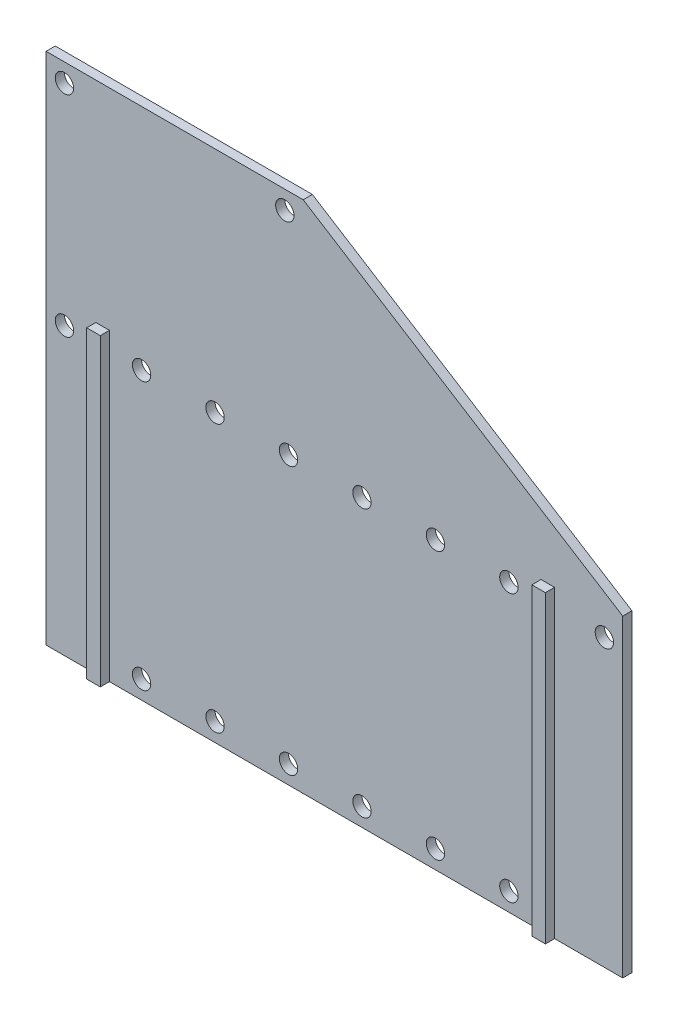
ISO-10303-21;
HEADER;
FILE_DESCRIPTION(('STEP AP214'),'2;1');
FILE_NAME('part.step','',(''),(''),'','','');
FILE_SCHEMA(('AUTOMOTIVE_DESIGN { 1 0 10303 214 1 1 1 1 }'));
ENDSEC;
DATA;
#1=APPLICATION_CONTEXT('core data for automotive mechanical design processes');
#2=APPLICATION_PROTOCOL_DEFINITION('international standard','automotive_design',2000,#1);
#3=PRODUCT_CONTEXT('',#1,'mechanical');
#4=PRODUCT('Part','Part','',(#3));
#5=PRODUCT_RELATED_PRODUCT_CATEGORY('part','',(#4));
#6=PRODUCT_DEFINITION_FORMATION('','',#4);
#7=PRODUCT_DEFINITION_CONTEXT('part definition',#1,'design');
#8=PRODUCT_DEFINITION('design','',#6,#7);
#9=PRODUCT_DEFINITION_SHAPE('','',#8);
#10=(LENGTH_UNIT() NAMED_UNIT(*) SI_UNIT(.MILLI.,.METRE.));
#11=(NAMED_UNIT(*) PLANE_ANGLE_UNIT() SI_UNIT($,.RADIAN.));
#12=(NAMED_UNIT(*) SI_UNIT($,.STERADIAN.) SOLID_ANGLE_UNIT());
#13=UNCERTAINTY_MEASURE_WITH_UNIT(LENGTH_MEASURE(1.E-05),#10,'distance_accuracy_value','');
#14=(GEOMETRIC_REPRESENTATION_CONTEXT(3) GLOBAL_UNCERTAINTY_ASSIGNED_CONTEXT((#13)) GLOBAL_UNIT_ASSIGNED_CONTEXT((#10,
#11,#12)) REPRESENTATION_CONTEXT('',''));
#15=CARTESIAN_POINT('',(0.,0.,0.));
#16=DIRECTION('',(0.,0.,1.));
#17=DIRECTION('',(1.,0.,0.));
#18=AXIS2_PLACEMENT_3D('',#15,#16,#17);
#19=CARTESIAN_POINT('',(0.,0.,3.175));
#20=DIRECTION('',(0.,0.,-1.));
#21=DIRECTION('',(-1.,0.,0.));
#22=AXIS2_PLACEMENT_3D('',#19,#20,#21);
#23=PLANE('',#22);
#24=CARTESIAN_POINT('',(-66.675,9.94999991200002,3.175));
#25=DIRECTION('',(0.,0.,1.));
#26=DIRECTION('',(1.,0.,0.));
#27=AXIS2_PLACEMENT_3D('',#24,#25,#26);
#28=CIRCLE('',#27,3.175);
#29=CARTESIAN_POINT('',(-63.5,9.94999991200002,3.175));
#30=VERTEX_POINT('',#29);
#31=EDGE_CURVE('E306',#30,#30,#28,.T.);
#32=ORIENTED_EDGE('',*,*,#31,.F.);
#33=EDGE_LOOP('',(#32));
#34=FACE_BOUND('',#33,.T.);
#35=CARTESIAN_POINT('',(-17.145,82.55,3.175));
#36=DIRECTION('',(0.,0.,1.));
#37=DIRECTION('',(1.,0.,0.));
#38=AXIS2_PLACEMENT_3D('',#35,#36,#37);
#39=CIRCLE('',#38,3.175);
#40=CARTESIAN_POINT('',(-13.97,82.55,3.175));
#41=VERTEX_POINT('',#40);
#42=EDGE_CURVE('E315',#41,#41,#39,.T.);
#43=ORIENTED_EDGE('',*,*,#42,.F.);
#44=EDGE_LOOP('',(#43));
#45=FACE_BOUND('',#44,.T.);
#46=CARTESIAN_POINT('',(-41.275,9.94999991200002,3.175));
#47=DIRECTION('',(0.,0.,1.));
#48=DIRECTION('',(1.,0.,0.));
#49=AXIS2_PLACEMENT_3D('',#46,#47,#48);
#50=CIRCLE('',#49,3.175);
#51=CARTESIAN_POINT('',(-38.1,9.94999991200002,3.175));
#52=VERTEX_POINT('',#51);
#53=EDGE_CURVE('E290',#52,#52,#50,.T.);
#54=ORIENTED_EDGE('',*,*,#53,.F.);
#55=EDGE_LOOP('',(#54));
#56=FACE_BOUND('',#55,.T.);
#57=CARTESIAN_POINT('',(-15.875,9.94999991200002,3.175));
#58=DIRECTION('',(0.,0.,1.));
#59=DIRECTION('',(1.,0.,0.));
#60=AXIS2_PLACEMENT_3D('',#57,#58,#59);
#61=CIRCLE('',#60,3.175);
#62=CARTESIAN_POINT('',(-12.7,9.94999991200002,3.175));
#63=VERTEX_POINT('',#62);
#64=EDGE_CURVE('E299',#63,#63,#61,.T.);
#65=ORIENTED_EDGE('',*,*,#64,.F.);
#66=EDGE_LOOP('',(#65));
#67=FACE_BOUND('',#66,.T.);
#68=CARTESIAN_POINT('',(-41.275,-82.55,3.175));
#69=DIRECTION('',(0.,0.,1.));
#70=DIRECTION('',(1.,0.,0.));
#71=AXIS2_PLACEMENT_3D('',#68,#69,#70);
#72=CIRCLE('',#71,3.175);
#73=CARTESIAN_POINT('',(-38.1,-82.55,3.175));
#74=VERTEX_POINT('',#73);
#75=EDGE_CURVE('E338',#74,#74,#72,.T.);
#76=ORIENTED_EDGE('',*,*,#75,.F.);
#77=EDGE_LOOP('',(#76));
#78=FACE_BOUND('',#77,.T.);
#79=CARTESIAN_POINT('',(-93.345,82.55,3.175));
#80=DIRECTION('',(0.,0.,1.));
#81=DIRECTION('',(1.,0.,0.));
#82=AXIS2_PLACEMENT_3D('',#79,#80,#81);
#83=CIRCLE('',#82,3.175);
#84=CARTESIAN_POINT('',(-90.17,82.55,3.175));
#85=VERTEX_POINT('',#84);
#86=EDGE_CURVE('E347',#85,#85,#83,.T.);
#87=ORIENTED_EDGE('',*,*,#86,.F.);
#88=EDGE_LOOP('',(#87));
#89=FACE_BOUND('',#88,.T.);
#90=CARTESIAN_POINT('',(-93.345,9.94999991200002,3.175));
#91=DIRECTION('',(0.,0.,1.));
#92=DIRECTION('',(1.,0.,0.));
#93=AXIS2_PLACEMENT_3D('',#90,#91,#92);
#94=CIRCLE('',#93,3.175);
#95=CARTESIAN_POINT('',(-90.17,9.94999991200002,3.175));
#96=VERTEX_POINT('',#95);
#97=EDGE_CURVE('E322',#96,#96,#94,.T.);
#98=ORIENTED_EDGE('',*,*,#97,.F.);
#99=EDGE_LOOP('',(#98));
#100=FACE_BOUND('',#99,.T.);
#101=CARTESIAN_POINT('',(93.345,9.94999991200002,3.175));
#102=DIRECTION('',(0.,0.,1.));
#103=DIRECTION('',(1.,0.,0.));
#104=AXIS2_PLACEMENT_3D('',#101,#102,#103);
#105=CIRCLE('',#104,3.175);
#106=CARTESIAN_POINT('',(96.52,9.94999991200002,3.175));
#107=VERTEX_POINT('',#106);
#108=EDGE_CURVE('E331',#107,#107,#105,.T.);
#109=ORIENTED_EDGE('',*,*,#108,.F.);
#110=EDGE_LOOP('',(#109));
#111=FACE_BOUND('',#110,.T.);
#112=CARTESIAN_POINT('',(60.325,-82.55,3.175));
#113=DIRECTION('',(0.,0.,1.));
#114=DIRECTION('',(1.,0.,0.));
#115=AXIS2_PLACEMENT_3D('',#112,#113,#114);
#116=CIRCLE('',#115,3.175);
#117=CARTESIAN_POINT('',(63.5,-82.55,3.175));
#118=VERTEX_POINT('',#117);
#119=EDGE_CURVE('E251',#118,#118,#116,.T.);
#120=ORIENTED_EDGE('',*,*,#119,.F.);
#121=EDGE_LOOP('',(#120));
#122=FACE_BOUND('',#121,.T.);
#123=CARTESIAN_POINT('',(34.925,-82.55,3.175));
#124=DIRECTION('',(0.,0.,1.));
#125=DIRECTION('',(1.,0.,0.));
#126=AXIS2_PLACEMENT_3D('',#123,#124,#125);
#127=CIRCLE('',#126,3.175);
#128=CARTESIAN_POINT('',(38.1,-82.55,3.175));
#129=VERTEX_POINT('',#128);
#130=EDGE_CURVE('E243',#129,#129,#127,.T.);
#131=ORIENTED_EDGE('',*,*,#130,.F.);
#132=EDGE_LOOP('',(#131));
#133=FACE_BOUND('',#132,.T.);
#134=CARTESIAN_POINT('',(9.52499999999998,-82.55,3.175));
#135=DIRECTION('',(0.,0.,1.));
#136=DIRECTION('',(1.,0.,0.));
#137=AXIS2_PLACEMENT_3D('',#134,#135,#136);
#138=CIRCLE('',#137,3.175);
#139=CARTESIAN_POINT('',(12.7,-82.55,3.175));
#140=VERTEX_POINT('',#139);
#141=EDGE_CURVE('E234',#140,#140,#138,.T.);
#142=ORIENTED_EDGE('',*,*,#141,.F.);
#143=EDGE_LOOP('',(#142));
#144=FACE_BOUND('',#143,.T.);
#145=CARTESIAN_POINT('',(9.52499999999995,9.94999991200002,3.175));
#146=DIRECTION('',(0.,0.,1.));
#147=DIRECTION('',(1.,0.,0.));
#148=AXIS2_PLACEMENT_3D('',#145,#146,#147);
#149=CIRCLE('',#148,3.175);
#150=CARTESIAN_POINT('',(12.6999999999999,9.94999991200002,3.175));
#151=VERTEX_POINT('',#150);
#152=EDGE_CURVE('E274',#151,#151,#149,.T.);
#153=ORIENTED_EDGE('',*,*,#152,.F.);
#154=EDGE_LOOP('',(#153));
#155=FACE_BOUND('',#154,.T.);
#156=CARTESIAN_POINT('',(34.9249999999999,9.94999991200002,3.175));
#157=DIRECTION('',(0.,0.,1.));
#158=DIRECTION('',(1.,0.,0.));
#159=AXIS2_PLACEMENT_3D('',#156,#157,#158);
#160=CIRCLE('',#159,3.175);
#161=CARTESIAN_POINT('',(38.0999999999999,9.94999991200002,3.175));
#162=VERTEX_POINT('',#161);
#163=EDGE_CURVE('E283',#162,#162,#160,.T.);
#164=ORIENTED_EDGE('',*,*,#163,.F.);
#165=EDGE_LOOP('',(#164));
#166=FACE_BOUND('',#165,.T.);
#167=CARTESIAN_POINT('',(60.3249999999999,9.94999991200002,3.175));
#168=DIRECTION('',(0.,0.,1.));
#169=DIRECTION('',(1.,0.,0.));
#170=AXIS2_PLACEMENT_3D('',#167,#168,#169);
#171=CIRCLE('',#170,3.175);
#172=CARTESIAN_POINT('',(63.4999999999999,9.94999991200002,3.175));
#173=VERTEX_POINT('',#172);
#174=EDGE_CURVE('E258',#173,#173,#171,.T.);
#175=ORIENTED_EDGE('',*,*,#174,.F.);
#176=EDGE_LOOP('',(#175));
#177=FACE_BOUND('',#176,.T.);
#178=CARTESIAN_POINT('',(-15.875,-82.55,3.175));
#179=DIRECTION('',(0.,0.,1.));
#180=DIRECTION('',(1.,0.,0.));
#181=AXIS2_PLACEMENT_3D('',#178,#179,#180);
#182=CIRCLE('',#181,3.175);
#183=CARTESIAN_POINT('',(-12.7,-82.55,3.175));
#184=VERTEX_POINT('',#183);
#185=EDGE_CURVE('E267',#184,#184,#182,.T.);
#186=ORIENTED_EDGE('',*,*,#185,.F.);
#187=EDGE_LOOP('',(#186));
#188=FACE_BOUND('',#187,.T.);
#189=CARTESIAN_POINT('',(-66.675,-82.55,3.175));
#190=DIRECTION('',(0.,0.,1.));
#191=DIRECTION('',(1.,0.,0.));
#192=AXIS2_PLACEMENT_3D('',#189,#190,#191);
#193=CIRCLE('',#192,3.175);
#194=CARTESIAN_POINT('',(-63.5,-82.55,3.175));
#195=VERTEX_POINT('',#194);
#196=EDGE_CURVE('E342',#195,#195,#193,.T.);
#197=ORIENTED_EDGE('',*,*,#196,.F.);
#198=EDGE_LOOP('',(#197));
#199=FACE_BOUND('',#198,.T.);
#200=DIRECTION('',(0.,1.,0.));
#201=VECTOR('',#200,1.);
#202=CARTESIAN_POINT('',(76.1364999999999,16.299999912,3.175));
#203=LINE('',#202,#201);
#204=CARTESIAN_POINT('',(76.1364999999999,-88.9,3.175));
#205=VERTEX_POINT('',#204);
#206=CARTESIAN_POINT('',(76.1364999999999,16.299999912,3.175));
#207=VERTEX_POINT('',#206);
#208=EDGE_CURVE('E154',#205,#207,#203,.T.);
#209=ORIENTED_EDGE('',*,*,#208,.F.);
#210=DIRECTION('',(1.,0.,0.));
#211=VECTOR('',#210,1.);
#212=CARTESIAN_POINT('',(-99.695,-88.9,3.175));
#213=LINE('',#212,#211);
#214=CARTESIAN_POINT('',(99.695,-88.9,3.175));
#215=VERTEX_POINT('',#214);
#216=EDGE_CURVE('E141',#205,#215,#213,.T.);
#217=ORIENTED_EDGE('',*,*,#216,.T.);
#218=DIRECTION('',(0.,1.,0.));
#219=VECTOR('',#218,1.);
#220=CARTESIAN_POINT('',(99.695,-88.9,3.175));
#221=LINE('',#220,#219);
#222=CARTESIAN_POINT('',(99.695,19.474999912,3.175));
#223=VERTEX_POINT('',#222);
#224=EDGE_CURVE('E151',#215,#223,#221,.T.);
#225=ORIENTED_EDGE('',*,*,#224,.T.);
#226=DIRECTION('',(0.846725815933061,-0.532029503535746,0.));
#227=VECTOR('',#226,1.);
#228=CARTESIAN_POINT('',(-10.795,88.9,3.175));
#229=LINE('',#228,#227);
#230=CARTESIAN_POINT('',(-10.795,88.9,3.175));
#231=VERTEX_POINT('',#230);
#232=EDGE_CURVE('E358',#231,#223,#229,.T.);
#233=ORIENTED_EDGE('',*,*,#232,.F.);
#234=DIRECTION('',(1.,0.,0.));
#235=VECTOR('',#234,1.);
#236=CARTESIAN_POINT('',(-99.695,88.9,3.175));
#237=LINE('',#236,#235);
#238=CARTESIAN_POINT('',(-99.695,88.9,3.175));
#239=VERTEX_POINT('',#238);
#240=EDGE_CURVE('E380',#239,#231,#237,.T.);
#241=ORIENTED_EDGE('',*,*,#240,.F.);
#242=DIRECTION('',(0.,1.,0.));
#243=VECTOR('',#242,1.);
#244=CARTESIAN_POINT('',(-99.695,-88.9,3.175));
#245=LINE('',#244,#243);
#246=CARTESIAN_POINT('',(-99.695,-88.9,3.175));
#247=VERTEX_POINT('',#246);
#248=EDGE_CURVE('E376',#247,#239,#245,.T.);
#249=ORIENTED_EDGE('',*,*,#248,.F.);
#250=CARTESIAN_POINT('',(-82.4865,-88.9,3.175));
#251=VERTEX_POINT('',#250);
#252=EDGE_CURVE('E153',#247,#251,#213,.T.);
#253=ORIENTED_EDGE('',*,*,#252,.T.);
#254=DIRECTION('',(0.,-1.,0.));
#255=VECTOR('',#254,1.);
#256=CARTESIAN_POINT('',(-82.4865,-88.9,3.175));
#257=LINE('',#256,#255);
#258=CARTESIAN_POINT('',(-82.4865,16.299999912,3.175));
#259=VERTEX_POINT('',#258);
#260=EDGE_CURVE('E211',#259,#251,#257,.T.);
#261=ORIENTED_EDGE('',*,*,#260,.F.);
#262=DIRECTION('',(-1.,0.,0.));
#263=VECTOR('',#262,1.);
#264=CARTESIAN_POINT('',(-82.4865,16.299999912,3.175));
#265=LINE('',#264,#263);
#266=CARTESIAN_POINT('',(-77.7875,16.299999912,3.175));
#267=VERTEX_POINT('',#266);
#268=EDGE_CURVE('E159',#267,#259,#265,.T.);
#269=ORIENTED_EDGE('',*,*,#268,.F.);
#270=DIRECTION('',(0.,1.,0.));
#271=VECTOR('',#270,1.);
#272=CARTESIAN_POINT('',(-77.7875,16.299999912,3.175));
#273=LINE('',#272,#271);
#274=CARTESIAN_POINT('',(-77.7875,-88.9,3.175));
#275=VERTEX_POINT('',#274);
#276=EDGE_CURVE('E198',#275,#267,#273,.T.);
#277=ORIENTED_EDGE('',*,*,#276,.F.);
#278=CARTESIAN_POINT('',(71.4375,-88.9,3.175));
#279=VERTEX_POINT('',#278);
#280=EDGE_CURVE('E150',#275,#279,#213,.T.);
#281=ORIENTED_EDGE('',*,*,#280,.T.);
#282=DIRECTION('',(0.,-1.,0.));
#283=VECTOR('',#282,1.);
#284=CARTESIAN_POINT('',(71.4375,16.299999912,3.175));
#285=LINE('',#284,#283);
#286=CARTESIAN_POINT('',(71.4375,16.299999912,3.175));
#287=VERTEX_POINT('',#286);
#288=EDGE_CURVE('E68',#287,#279,#285,.T.);
#289=ORIENTED_EDGE('',*,*,#288,.F.);
#290=DIRECTION('',(-1.,0.,0.));
#291=VECTOR('',#290,1.);
#292=CARTESIAN_POINT('',(71.4375,16.299999912,3.175));
#293=LINE('',#292,#291);
#294=EDGE_CURVE('E63',#207,#287,#293,.T.);
#295=ORIENTED_EDGE('',*,*,#294,.F.);
#296=EDGE_LOOP('',(#209,#217,#225,#233,#241,#249,#253,#261,#269,#277,#281,#289,#295));
#297=FACE_BOUND('',#296,.T.);
#298=ADVANCED_FACE('F45',(#34,#45,#56,#67,#78,#89,#100,#111,#122,#133,#144,#155,#166,#177,#188,
#199,#297),#23,.F.);
#299=CARTESIAN_POINT('',(-99.695,-88.9,3.175));
#300=DIRECTION('',(-1.,0.,0.));
#301=DIRECTION('',(0.,0.,1.));
#302=AXIS2_PLACEMENT_3D('',#299,#300,#301);
#303=PLANE('',#302);
#304=DIRECTION('',(0.,1.,0.));
#305=VECTOR('',#304,1.);
#306=CARTESIAN_POINT('',(-99.695,-88.9,0.));
#307=LINE('',#306,#305);
#308=CARTESIAN_POINT('',(-99.695,-88.9,0.));
#309=VERTEX_POINT('',#308);
#310=CARTESIAN_POINT('',(-99.695,88.9,0.));
#311=VERTEX_POINT('',#310);
#312=EDGE_CURVE('E372',#309,#311,#307,.T.);
#313=ORIENTED_EDGE('',*,*,#312,.F.);
#314=DIRECTION('',(0.,0.,-1.));
#315=VECTOR('',#314,1.);
#316=CARTESIAN_POINT('',(-99.695,-88.9,3.175));
#317=LINE('',#316,#315);
#318=EDGE_CURVE('E11',#247,#309,#317,.T.);
#319=ORIENTED_EDGE('',*,*,#318,.F.);
#320=ORIENTED_EDGE('',*,*,#248,.T.);
#321=DIRECTION('',(0.,0.,-1.));
#322=VECTOR('',#321,1.);
#323=CARTESIAN_POINT('',(-99.695,88.9,3.175));
#324=LINE('',#323,#322);
#325=EDGE_CURVE('E49',#239,#311,#324,.T.);
#326=ORIENTED_EDGE('',*,*,#325,.T.);
#327=EDGE_LOOP('',(#313,#319,#320,#326));
#328=FACE_BOUND('',#327,.T.);
#329=ADVANCED_FACE('F47',(#328),#303,.T.);
#330=CARTESIAN_POINT('',(-99.695,-88.9,3.175));
#331=DIRECTION('',(0.,1.,0.));
#332=DIRECTION('',(0.,0.,1.));
#333=AXIS2_PLACEMENT_3D('',#330,#331,#332);
#334=PLANE('',#333);
#335=DIRECTION('',(1.,0.,0.));
#336=VECTOR('',#335,1.);
#337=CARTESIAN_POINT('',(-99.695,-88.9,0.));
#338=LINE('',#337,#336);
#339=CARTESIAN_POINT('',(99.695,-88.9,0.));
#340=VERTEX_POINT('',#339);
#341=EDGE_CURVE('E381',#309,#340,#338,.T.);
#342=ORIENTED_EDGE('',*,*,#341,.T.);
#343=DIRECTION('',(0.,0.,-1.));
#344=VECTOR('',#343,1.);
#345=CARTESIAN_POINT('',(99.695,-88.9,3.175));
#346=LINE('',#345,#344);
#347=EDGE_CURVE('E55',#215,#340,#346,.T.);
#348=ORIENTED_EDGE('',*,*,#347,.F.);
#349=ORIENTED_EDGE('',*,*,#216,.F.);
#350=DIRECTION('',(0.,0.,-1.));
#351=VECTOR('',#350,1.);
#352=CARTESIAN_POINT('',(76.1364999999999,-88.9,6.35));
#353=LINE('',#352,#351);
#354=CARTESIAN_POINT('',(76.1364999999999,-88.9,6.35));
#355=VERTEX_POINT('',#354);
#356=EDGE_CURVE('E145',#355,#205,#353,.T.);
#357=ORIENTED_EDGE('',*,*,#356,.F.);
#358=DIRECTION('',(1.,0.,0.));
#359=VECTOR('',#358,1.);
#360=CARTESIAN_POINT('',(71.4375,-88.9,6.35));
#361=LINE('',#360,#359);
#362=CARTESIAN_POINT('',(71.4375,-88.9,6.35));
#363=VERTEX_POINT('',#362);
#364=EDGE_CURVE('E181',#363,#355,#361,.T.);
#365=ORIENTED_EDGE('',*,*,#364,.F.);
#366=DIRECTION('',(0.,0.,-1.));
#367=VECTOR('',#366,1.);
#368=CARTESIAN_POINT('',(71.4375,-88.9,6.35));
#369=LINE('',#368,#367);
#370=EDGE_CURVE('E174',#363,#279,#369,.T.);
#371=ORIENTED_EDGE('',*,*,#370,.T.);
#372=ORIENTED_EDGE('',*,*,#280,.F.);
#373=DIRECTION('',(0.,0.,-1.));
#374=VECTOR('',#373,1.);
#375=CARTESIAN_POINT('',(-77.7875,-88.9,6.35));
#376=LINE('',#375,#374);
#377=CARTESIAN_POINT('',(-77.7875,-88.9,6.35));
#378=VERTEX_POINT('',#377);
#379=EDGE_CURVE('E221',#378,#275,#376,.T.);
#380=ORIENTED_EDGE('',*,*,#379,.F.);
#381=DIRECTION('',(1.,0.,0.));
#382=VECTOR('',#381,1.);
#383=CARTESIAN_POINT('',(-82.4865,-88.9,6.35));
#384=LINE('',#383,#382);
#385=CARTESIAN_POINT('',(-82.4865,-88.9,6.35));
#386=VERTEX_POINT('',#385);
#387=EDGE_CURVE('E201',#386,#378,#384,.T.);
#388=ORIENTED_EDGE('',*,*,#387,.F.);
#389=DIRECTION('',(0.,0.,-1.));
#390=VECTOR('',#389,1.);
#391=CARTESIAN_POINT('',(-82.4865,-88.9,6.35));
#392=LINE('',#391,#390);
#393=EDGE_CURVE('E225',#386,#251,#392,.T.);
#394=ORIENTED_EDGE('',*,*,#393,.T.);
#395=ORIENTED_EDGE('',*,*,#252,.F.);
#396=ORIENTED_EDGE('',*,*,#318,.T.);
#397=EDGE_LOOP('',(#342,#348,#349,#357,#365,#371,#372,#380,#388,#394,#395,#396));
#398=FACE_BOUND('',#397,.T.);
#399=ADVANCED_FACE('F142',(#398),#334,.F.);
#400=CARTESIAN_POINT('',(99.695,-88.9,3.175));
#401=DIRECTION('',(-1.,0.,0.));
#402=DIRECTION('',(0.,0.,1.));
#403=AXIS2_PLACEMENT_3D('',#400,#401,#402);
#404=PLANE('',#403);
#405=DIRECTION('',(0.,1.,0.));
#406=VECTOR('',#405,1.);
#407=CARTESIAN_POINT('',(99.695,-88.9,0.));
#408=LINE('',#407,#406);
#409=CARTESIAN_POINT('',(99.695,19.474999912,0.));
#410=VERTEX_POINT('',#409);
#411=EDGE_CURVE('E395',#340,#410,#408,.T.);
#412=ORIENTED_EDGE('',*,*,#411,.T.);
#413=DIRECTION('',(0.,0.,1.));
#414=VECTOR('',#413,1.);
#415=CARTESIAN_POINT('',(99.695,19.474999912,0.));
#416=LINE('',#415,#414);
#417=EDGE_CURVE('E366',#410,#223,#416,.T.);
#418=ORIENTED_EDGE('',*,*,#417,.T.);
#419=ORIENTED_EDGE('',*,*,#224,.F.);
#420=ORIENTED_EDGE('',*,*,#347,.T.);
#421=EDGE_LOOP('',(#412,#418,#419,#420));
#422=FACE_BOUND('',#421,.T.);
#423=ADVANCED_FACE('F421',(#422),#404,.F.);
#424=CARTESIAN_POINT('',(-99.695,88.9,3.175));
#425=DIRECTION('',(0.,1.,0.));
#426=DIRECTION('',(0.,0.,1.));
#427=AXIS2_PLACEMENT_3D('',#424,#425,#426);
#428=PLANE('',#427);
#429=DIRECTION('',(0.,0.,1.));
#430=VECTOR('',#429,1.);
#431=CARTESIAN_POINT('',(-10.795,88.9,0.));
#432=LINE('',#431,#430);
#433=CARTESIAN_POINT('',(-10.795,88.9,0.));
#434=VERTEX_POINT('',#433);
#435=EDGE_CURVE('E369',#434,#231,#432,.T.);
#436=ORIENTED_EDGE('',*,*,#435,.F.);
#437=DIRECTION('',(1.,0.,0.));
#438=VECTOR('',#437,1.);
#439=CARTESIAN_POINT('',(-99.695,88.9,0.));
#440=LINE('',#439,#438);
#441=EDGE_CURVE('E391',#311,#434,#440,.T.);
#442=ORIENTED_EDGE('',*,*,#441,.F.);
#443=ORIENTED_EDGE('',*,*,#325,.F.);
#444=ORIENTED_EDGE('',*,*,#240,.T.);
#445=EDGE_LOOP('',(#436,#442,#443,#444));
#446=FACE_BOUND('',#445,.T.);
#447=ADVANCED_FACE('F411',(#446),#428,.T.);
#448=CARTESIAN_POINT('',(0.,0.,0.));
#449=DIRECTION('',(0.,0.,-1.));
#450=DIRECTION('',(-1.,0.,0.));
#451=AXIS2_PLACEMENT_3D('',#448,#449,#450);
#452=PLANE('',#451);
#453=CARTESIAN_POINT('',(-66.675,9.94999991200002,0.));
#454=DIRECTION('',(0.,0.,1.));
#455=DIRECTION('',(1.,0.,0.));
#456=AXIS2_PLACEMENT_3D('',#453,#454,#455);
#457=CIRCLE('',#456,3.175);
#458=CARTESIAN_POINT('',(-63.5,9.94999991200002,0.));
#459=VERTEX_POINT('',#458);
#460=EDGE_CURVE('E311',#459,#459,#457,.T.);
#461=ORIENTED_EDGE('',*,*,#460,.T.);
#462=EDGE_LOOP('',(#461));
#463=FACE_BOUND('',#462,.T.);
#464=CARTESIAN_POINT('',(-17.145,82.55,0.));
#465=DIRECTION('',(0.,0.,1.));
#466=DIRECTION('',(1.,0.,0.));
#467=AXIS2_PLACEMENT_3D('',#464,#465,#466);
#468=CIRCLE('',#467,3.175);
#469=CARTESIAN_POINT('',(-13.97,82.55,0.));
#470=VERTEX_POINT('',#469);
#471=EDGE_CURVE('E294',#470,#470,#468,.T.);
#472=ORIENTED_EDGE('',*,*,#471,.T.);
#473=EDGE_LOOP('',(#472));
#474=FACE_BOUND('',#473,.T.);
#475=CARTESIAN_POINT('',(-41.275,9.94999991200002,0.));
#476=DIRECTION('',(0.,0.,1.));
#477=DIRECTION('',(1.,0.,0.));
#478=AXIS2_PLACEMENT_3D('',#475,#476,#477);
#479=CIRCLE('',#478,3.175);
#480=CARTESIAN_POINT('',(-38.1,9.94999991200002,0.));
#481=VERTEX_POINT('',#480);
#482=EDGE_CURVE('E295',#481,#481,#479,.T.);
#483=ORIENTED_EDGE('',*,*,#482,.T.);
#484=EDGE_LOOP('',(#483));
#485=FACE_BOUND('',#484,.T.);
#486=CARTESIAN_POINT('',(-15.875,9.94999991200002,0.));
#487=DIRECTION('',(0.,0.,1.));
#488=DIRECTION('',(1.,0.,0.));
#489=AXIS2_PLACEMENT_3D('',#486,#487,#488);
#490=CIRCLE('',#489,3.175);
#491=CARTESIAN_POINT('',(-12.7,9.94999991200002,0.));
#492=VERTEX_POINT('',#491);
#493=EDGE_CURVE('E278',#492,#492,#490,.T.);
#494=ORIENTED_EDGE('',*,*,#493,.T.);
#495=EDGE_LOOP('',(#494));
#496=FACE_BOUND('',#495,.T.);
#497=CARTESIAN_POINT('',(-41.275,-82.55,0.));
#498=DIRECTION('',(0.,0.,1.));
#499=DIRECTION('',(1.,0.,0.));
#500=AXIS2_PLACEMENT_3D('',#497,#498,#499);
#501=CIRCLE('',#500,3.175);
#502=CARTESIAN_POINT('',(-38.1,-82.55,0.));
#503=VERTEX_POINT('',#502);
#504=EDGE_CURVE('E343',#503,#503,#501,.T.);
#505=ORIENTED_EDGE('',*,*,#504,.T.);
#506=EDGE_LOOP('',(#505));
#507=FACE_BOUND('',#506,.T.);
#508=CARTESIAN_POINT('',(-93.345,82.55,0.));
#509=DIRECTION('',(0.,0.,1.));
#510=DIRECTION('',(1.,0.,0.));
#511=AXIS2_PLACEMENT_3D('',#508,#509,#510);
#512=CIRCLE('',#511,3.175);
#513=CARTESIAN_POINT('',(-90.17,82.55,0.));
#514=VERTEX_POINT('',#513);
#515=EDGE_CURVE('E326',#514,#514,#512,.T.);
#516=ORIENTED_EDGE('',*,*,#515,.T.);
#517=EDGE_LOOP('',(#516));
#518=FACE_BOUND('',#517,.T.);
#519=CARTESIAN_POINT('',(-93.345,9.94999991200002,0.));
#520=DIRECTION('',(0.,0.,1.));
#521=DIRECTION('',(1.,0.,0.));
#522=AXIS2_PLACEMENT_3D('',#519,#520,#521);
#523=CIRCLE('',#522,3.175);
#524=CARTESIAN_POINT('',(-90.17,9.94999991200002,0.));
#525=VERTEX_POINT('',#524);
#526=EDGE_CURVE('E327',#525,#525,#523,.T.);
#527=ORIENTED_EDGE('',*,*,#526,.T.);
#528=EDGE_LOOP('',(#527));
#529=FACE_BOUND('',#528,.T.);
#530=CARTESIAN_POINT('',(93.345,9.94999991200002,0.));
#531=DIRECTION('',(0.,0.,1.));
#532=DIRECTION('',(1.,0.,0.));
#533=AXIS2_PLACEMENT_3D('',#530,#531,#532);
#534=CIRCLE('',#533,3.175);
#535=CARTESIAN_POINT('',(96.52,9.94999991200002,0.));
#536=VERTEX_POINT('',#535);
#537=EDGE_CURVE('E310',#536,#536,#534,.T.);
#538=ORIENTED_EDGE('',*,*,#537,.T.);
#539=EDGE_LOOP('',(#538));
#540=FACE_BOUND('',#539,.T.);
#541=CARTESIAN_POINT('',(60.325,-82.55,0.));
#542=DIRECTION('',(0.,0.,1.));
#543=DIRECTION('',(1.,0.,0.));
#544=AXIS2_PLACEMENT_3D('',#541,#542,#543);
#545=CIRCLE('',#544,3.175);
#546=CARTESIAN_POINT('',(63.5,-82.55,0.));
#547=VERTEX_POINT('',#546);
#548=EDGE_CURVE('E233',#547,#547,#545,.T.);
#549=ORIENTED_EDGE('',*,*,#548,.T.);
#550=EDGE_LOOP('',(#549));
#551=FACE_BOUND('',#550,.T.);
#552=CARTESIAN_POINT('',(34.925,-82.55,0.));
#553=DIRECTION('',(0.,0.,1.));
#554=DIRECTION('',(1.,0.,0.));
#555=AXIS2_PLACEMENT_3D('',#552,#553,#554);
#556=CIRCLE('',#555,3.175);
#557=CARTESIAN_POINT('',(38.1,-82.55,0.));
#558=VERTEX_POINT('',#557);
#559=EDGE_CURVE('E247',#558,#558,#556,.T.);
#560=ORIENTED_EDGE('',*,*,#559,.T.);
#561=EDGE_LOOP('',(#560));
#562=FACE_BOUND('',#561,.T.);
#563=CARTESIAN_POINT('',(9.52499999999998,-82.55,0.));
#564=DIRECTION('',(0.,0.,1.));
#565=DIRECTION('',(1.,0.,0.));
#566=AXIS2_PLACEMENT_3D('',#563,#564,#565);
#567=CIRCLE('',#566,3.175);
#568=CARTESIAN_POINT('',(12.7,-82.55,0.));
#569=VERTEX_POINT('',#568);
#570=EDGE_CURVE('E239',#569,#569,#567,.T.);
#571=ORIENTED_EDGE('',*,*,#570,.T.);
#572=EDGE_LOOP('',(#571));
#573=FACE_BOUND('',#572,.T.);
#574=CARTESIAN_POINT('',(9.52499999999995,9.94999991200002,0.));
#575=DIRECTION('',(0.,0.,1.));
#576=DIRECTION('',(1.,0.,0.));
#577=AXIS2_PLACEMENT_3D('',#574,#575,#576);
#578=CIRCLE('',#577,3.175);
#579=CARTESIAN_POINT('',(12.6999999999999,9.94999991200002,0.));
#580=VERTEX_POINT('',#579);
#581=EDGE_CURVE('E279',#580,#580,#578,.T.);
#582=ORIENTED_EDGE('',*,*,#581,.T.);
#583=EDGE_LOOP('',(#582));
#584=FACE_BOUND('',#583,.T.);
#585=CARTESIAN_POINT('',(34.9249999999999,9.94999991200002,0.));
#586=DIRECTION('',(0.,0.,1.));
#587=DIRECTION('',(1.,0.,0.));
#588=AXIS2_PLACEMENT_3D('',#585,#586,#587);
#589=CIRCLE('',#588,3.175);
#590=CARTESIAN_POINT('',(38.0999999999999,9.94999991200002,0.));
#591=VERTEX_POINT('',#590);
#592=EDGE_CURVE('E262',#591,#591,#589,.T.);
#593=ORIENTED_EDGE('',*,*,#592,.T.);
#594=EDGE_LOOP('',(#593));
#595=FACE_BOUND('',#594,.T.);
#596=CARTESIAN_POINT('',(60.3249999999999,9.94999991200002,0.));
#597=DIRECTION('',(0.,0.,1.));
#598=DIRECTION('',(1.,0.,0.));
#599=AXIS2_PLACEMENT_3D('',#596,#597,#598);
#600=CIRCLE('',#599,3.175);
#601=CARTESIAN_POINT('',(63.4999999999999,9.94999991200002,0.));
#602=VERTEX_POINT('',#601);
#603=EDGE_CURVE('E263',#602,#602,#600,.T.);
#604=ORIENTED_EDGE('',*,*,#603,.T.);
#605=EDGE_LOOP('',(#604));
#606=FACE_BOUND('',#605,.T.);
#607=CARTESIAN_POINT('',(-15.875,-82.55,0.));
#608=DIRECTION('',(0.,0.,1.));
#609=DIRECTION('',(1.,0.,0.));
#610=AXIS2_PLACEMENT_3D('',#607,#608,#609);
#611=CIRCLE('',#610,3.175);
#612=CARTESIAN_POINT('',(-12.7,-82.55,0.));
#613=VERTEX_POINT('',#612);
#614=EDGE_CURVE('E238',#613,#613,#611,.T.);
#615=ORIENTED_EDGE('',*,*,#614,.T.);
#616=EDGE_LOOP('',(#615));
#617=FACE_BOUND('',#616,.T.);
#618=CARTESIAN_POINT('',(-66.675,-82.55,0.));
#619=DIRECTION('',(0.,0.,1.));
#620=DIRECTION('',(1.,0.,0.));
#621=AXIS2_PLACEMENT_3D('',#618,#619,#620);
#622=CIRCLE('',#621,3.175);
#623=CARTESIAN_POINT('',(-63.5,-82.55,0.));
#624=VERTEX_POINT('',#623);
#625=EDGE_CURVE('E354',#624,#624,#622,.T.);
#626=ORIENTED_EDGE('',*,*,#625,.T.);
#627=EDGE_LOOP('',(#626));
#628=FACE_BOUND('',#627,.T.);
#629=DIRECTION('',(0.846725815933061,-0.532029503535746,0.));
#630=VECTOR('',#629,1.);
#631=CARTESIAN_POINT('',(-10.795,88.9,0.));
#632=LINE('',#631,#630);
#633=EDGE_CURVE('E362',#434,#410,#632,.T.);
#634=ORIENTED_EDGE('',*,*,#633,.T.);
#635=ORIENTED_EDGE('',*,*,#411,.F.);
#636=ORIENTED_EDGE('',*,*,#341,.F.);
#637=ORIENTED_EDGE('',*,*,#312,.T.);
#638=ORIENTED_EDGE('',*,*,#441,.T.);
#639=EDGE_LOOP('',(#634,#635,#636,#637,#638));
#640=FACE_BOUND('',#639,.T.);
#641=ADVANCED_FACE('F414',(#463,#474,#485,#496,#507,#518,#529,#540,#551,#562,#573,#584,#595,
#606,#617,#628,#640),#452,.T.);
#642=CARTESIAN_POINT('',(-10.795,88.9,0.));
#643=DIRECTION('',(-0.532029503535746,-0.846725815933061,0.));
#644=DIRECTION('',(0.846725815933061,-0.532029503535746,0.));
#645=AXIS2_PLACEMENT_3D('',#642,#643,#644);
#646=PLANE('',#645);
#647=ORIENTED_EDGE('',*,*,#232,.T.);
#648=ORIENTED_EDGE('',*,*,#417,.F.);
#649=ORIENTED_EDGE('',*,*,#633,.F.);
#650=ORIENTED_EDGE('',*,*,#435,.T.);
#651=EDGE_LOOP('',(#647,#648,#649,#650));
#652=FACE_BOUND('',#651,.T.);
#653=ADVANCED_FACE('F420',(#652),#646,.F.);
#654=CARTESIAN_POINT('',(-66.675,-82.55,0.));
#655=DIRECTION('',(0.,0.,1.));
#656=DIRECTION('',(1.,0.,0.));
#657=AXIS2_PLACEMENT_3D('',#654,#655,#656);
#658=CYLINDRICAL_SURFACE('',#657,3.175);
#659=ORIENTED_EDGE('',*,*,#625,.F.);
#660=EDGE_LOOP('',(#659));
#661=FACE_BOUND('',#660,.T.);
#662=ORIENTED_EDGE('',*,*,#196,.T.);
#663=EDGE_LOOP('',(#662));
#664=FACE_BOUND('',#663,.T.);
#665=ADVANCED_FACE('F447',(#661,#664),#658,.F.);
#666=CARTESIAN_POINT('',(-15.875,-82.55,0.));
#667=DIRECTION('',(0.,0.,1.));
#668=DIRECTION('',(1.,0.,0.));
#669=AXIS2_PLACEMENT_3D('',#666,#667,#668);
#670=CYLINDRICAL_SURFACE('',#669,3.175);
#671=ORIENTED_EDGE('',*,*,#614,.F.);
#672=EDGE_LOOP('',(#671));
#673=FACE_BOUND('',#672,.T.);
#674=ORIENTED_EDGE('',*,*,#185,.T.);
#675=EDGE_LOOP('',(#674));
#676=FACE_BOUND('',#675,.T.);
#677=ADVANCED_FACE('F481',(#673,#676),#670,.F.);
#678=CARTESIAN_POINT('',(60.3249999999999,9.94999991200002,0.));
#679=DIRECTION('',(0.,0.,1.));
#680=DIRECTION('',(1.,0.,0.));
#681=AXIS2_PLACEMENT_3D('',#678,#679,#680);
#682=CYLINDRICAL_SURFACE('',#681,3.175);
#683=ORIENTED_EDGE('',*,*,#603,.F.);
#684=EDGE_LOOP('',(#683));
#685=FACE_BOUND('',#684,.T.);
#686=ORIENTED_EDGE('',*,*,#174,.T.);
#687=EDGE_LOOP('',(#686));
#688=FACE_BOUND('',#687,.T.);
#689=ADVANCED_FACE('F487',(#685,#688),#682,.F.);
#690=CARTESIAN_POINT('',(34.9249999999999,9.94999991200002,0.));
#691=DIRECTION('',(0.,0.,1.));
#692=DIRECTION('',(1.,0.,0.));
#693=AXIS2_PLACEMENT_3D('',#690,#691,#692);
#694=CYLINDRICAL_SURFACE('',#693,3.175);
#695=ORIENTED_EDGE('',*,*,#592,.F.);
#696=EDGE_LOOP('',(#695));
#697=FACE_BOUND('',#696,.T.);
#698=ORIENTED_EDGE('',*,*,#163,.T.);
#699=EDGE_LOOP('',(#698));
#700=FACE_BOUND('',#699,.T.);
#701=ADVANCED_FACE('F524',(#697,#700),#694,.F.);
#702=CARTESIAN_POINT('',(9.52499999999995,9.94999991200002,0.));
#703=DIRECTION('',(0.,0.,1.));
#704=DIRECTION('',(1.,0.,0.));
#705=AXIS2_PLACEMENT_3D('',#702,#703,#704);
#706=CYLINDRICAL_SURFACE('',#705,3.175);
#707=ORIENTED_EDGE('',*,*,#581,.F.);
#708=EDGE_LOOP('',(#707));
#709=FACE_BOUND('',#708,.T.);
#710=ORIENTED_EDGE('',*,*,#152,.T.);
#711=EDGE_LOOP('',(#710));
#712=FACE_BOUND('',#711,.T.);
#713=ADVANCED_FACE('F527',(#709,#712),#706,.F.);
#714=CARTESIAN_POINT('',(9.52499999999998,-82.55,0.));
#715=DIRECTION('',(0.,0.,1.));
#716=DIRECTION('',(1.,0.,0.));
#717=AXIS2_PLACEMENT_3D('',#714,#715,#716);
#718=CYLINDRICAL_SURFACE('',#717,3.175);
#719=ORIENTED_EDGE('',*,*,#570,.F.);
#720=EDGE_LOOP('',(#719));
#721=FACE_BOUND('',#720,.T.);
#722=ORIENTED_EDGE('',*,*,#141,.T.);
#723=EDGE_LOOP('',(#722));
#724=FACE_BOUND('',#723,.T.);
#725=ADVANCED_FACE('F530',(#721,#724),#718,.F.);
#726=CARTESIAN_POINT('',(34.925,-82.55,0.));
#727=DIRECTION('',(0.,0.,1.));
#728=DIRECTION('',(1.,0.,0.));
#729=AXIS2_PLACEMENT_3D('',#726,#727,#728);
#730=CYLINDRICAL_SURFACE('',#729,3.175);
#731=ORIENTED_EDGE('',*,*,#559,.F.);
#732=EDGE_LOOP('',(#731));
#733=FACE_BOUND('',#732,.T.);
#734=ORIENTED_EDGE('',*,*,#130,.T.);
#735=EDGE_LOOP('',(#734));
#736=FACE_BOUND('',#735,.T.);
#737=ADVANCED_FACE('F538',(#733,#736),#730,.F.);
#738=CARTESIAN_POINT('',(60.325,-82.55,0.));
#739=DIRECTION('',(0.,0.,1.));
#740=DIRECTION('',(1.,0.,0.));
#741=AXIS2_PLACEMENT_3D('',#738,#739,#740);
#742=CYLINDRICAL_SURFACE('',#741,3.175);
#743=ORIENTED_EDGE('',*,*,#548,.F.);
#744=EDGE_LOOP('',(#743));
#745=FACE_BOUND('',#744,.T.);
#746=ORIENTED_EDGE('',*,*,#119,.T.);
#747=EDGE_LOOP('',(#746));
#748=FACE_BOUND('',#747,.T.);
#749=ADVANCED_FACE('F504',(#745,#748),#742,.F.);
#750=CARTESIAN_POINT('',(93.345,9.94999991200002,0.));
#751=DIRECTION('',(0.,0.,1.));
#752=DIRECTION('',(1.,0.,0.));
#753=AXIS2_PLACEMENT_3D('',#750,#751,#752);
#754=CYLINDRICAL_SURFACE('',#753,3.175);
#755=ORIENTED_EDGE('',*,*,#537,.F.);
#756=EDGE_LOOP('',(#755));
#757=FACE_BOUND('',#756,.T.);
#758=ORIENTED_EDGE('',*,*,#108,.T.);
#759=EDGE_LOOP('',(#758));
#760=FACE_BOUND('',#759,.T.);
#761=ADVANCED_FACE('F501',(#757,#760),#754,.F.);
#762=CARTESIAN_POINT('',(-93.345,9.94999991200002,0.));
#763=DIRECTION('',(0.,0.,1.));
#764=DIRECTION('',(1.,0.,0.));
#765=AXIS2_PLACEMENT_3D('',#762,#763,#764);
#766=CYLINDRICAL_SURFACE('',#765,3.175);
#767=ORIENTED_EDGE('',*,*,#526,.F.);
#768=EDGE_LOOP('',(#767));
#769=FACE_BOUND('',#768,.T.);
#770=ORIENTED_EDGE('',*,*,#97,.T.);
#771=EDGE_LOOP('',(#770));
#772=FACE_BOUND('',#771,.T.);
#773=ADVANCED_FACE('F495',(#769,#772),#766,.F.);
#774=CARTESIAN_POINT('',(-93.345,82.55,0.));
#775=DIRECTION('',(0.,0.,1.));
#776=DIRECTION('',(1.,0.,0.));
#777=AXIS2_PLACEMENT_3D('',#774,#775,#776);
#778=CYLINDRICAL_SURFACE('',#777,3.175);
#779=ORIENTED_EDGE('',*,*,#515,.F.);
#780=EDGE_LOOP('',(#779));
#781=FACE_BOUND('',#780,.T.);
#782=ORIENTED_EDGE('',*,*,#86,.T.);
#783=EDGE_LOOP('',(#782));
#784=FACE_BOUND('',#783,.T.);
#785=ADVANCED_FACE('F491',(#781,#784),#778,.F.);
#786=CARTESIAN_POINT('',(-41.275,-82.55,0.));
#787=DIRECTION('',(0.,0.,1.));
#788=DIRECTION('',(1.,0.,0.));
#789=AXIS2_PLACEMENT_3D('',#786,#787,#788);
#790=CYLINDRICAL_SURFACE('',#789,3.175);
#791=ORIENTED_EDGE('',*,*,#504,.F.);
#792=EDGE_LOOP('',(#791));
#793=FACE_BOUND('',#792,.T.);
#794=ORIENTED_EDGE('',*,*,#75,.T.);
#795=EDGE_LOOP('',(#794));
#796=FACE_BOUND('',#795,.T.);
#797=ADVANCED_FACE('F494',(#793,#796),#790,.F.);
#798=CARTESIAN_POINT('',(-15.875,9.94999991200002,0.));
#799=DIRECTION('',(0.,0.,1.));
#800=DIRECTION('',(1.,0.,0.));
#801=AXIS2_PLACEMENT_3D('',#798,#799,#800);
#802=CYLINDRICAL_SURFACE('',#801,3.175);
#803=ORIENTED_EDGE('',*,*,#493,.F.);
#804=EDGE_LOOP('',(#803));
#805=FACE_BOUND('',#804,.T.);
#806=ORIENTED_EDGE('',*,*,#64,.T.);
#807=EDGE_LOOP('',(#806));
#808=FACE_BOUND('',#807,.T.);
#809=ADVANCED_FACE('F499',(#805,#808),#802,.F.);
#810=CARTESIAN_POINT('',(-41.275,9.94999991200002,0.));
#811=DIRECTION('',(0.,0.,1.));
#812=DIRECTION('',(1.,0.,0.));
#813=AXIS2_PLACEMENT_3D('',#810,#811,#812);
#814=CYLINDRICAL_SURFACE('',#813,3.175);
#815=ORIENTED_EDGE('',*,*,#482,.F.);
#816=EDGE_LOOP('',(#815));
#817=FACE_BOUND('',#816,.T.);
#818=ORIENTED_EDGE('',*,*,#53,.T.);
#819=EDGE_LOOP('',(#818));
#820=FACE_BOUND('',#819,.T.);
#821=ADVANCED_FACE('F513',(#817,#820),#814,.F.);
#822=CARTESIAN_POINT('',(-17.145,82.55,0.));
#823=DIRECTION('',(0.,0.,1.));
#824=DIRECTION('',(1.,0.,0.));
#825=AXIS2_PLACEMENT_3D('',#822,#823,#824);
#826=CYLINDRICAL_SURFACE('',#825,3.175);
#827=ORIENTED_EDGE('',*,*,#471,.F.);
#828=EDGE_LOOP('',(#827));
#829=FACE_BOUND('',#828,.T.);
#830=ORIENTED_EDGE('',*,*,#42,.T.);
#831=EDGE_LOOP('',(#830));
#832=FACE_BOUND('',#831,.T.);
#833=ADVANCED_FACE('F509',(#829,#832),#826,.F.);
#834=CARTESIAN_POINT('',(-66.675,9.94999991200002,0.));
#835=DIRECTION('',(0.,0.,1.));
#836=DIRECTION('',(1.,0.,0.));
#837=AXIS2_PLACEMENT_3D('',#834,#835,#836);
#838=CYLINDRICAL_SURFACE('',#837,3.175);
#839=ORIENTED_EDGE('',*,*,#460,.F.);
#840=EDGE_LOOP('',(#839));
#841=FACE_BOUND('',#840,.T.);
#842=ORIENTED_EDGE('',*,*,#31,.T.);
#843=EDGE_LOOP('',(#842));
#844=FACE_BOUND('',#843,.T.);
#845=ADVANCED_FACE('F512',(#841,#844),#838,.F.);
#846=CARTESIAN_POINT('',(-82.4865,16.299999912,6.35));
#847=DIRECTION('',(0.,-1.,0.));
#848=DIRECTION('',(1.,0.,0.));
#849=AXIS2_PLACEMENT_3D('',#846,#847,#848);
#850=PLANE('',#849);
#851=ORIENTED_EDGE('',*,*,#268,.T.);
#852=DIRECTION('',(0.,0.,-1.));
#853=VECTOR('',#852,1.);
#854=CARTESIAN_POINT('',(-82.4865,16.299999912,6.35));
#855=LINE('',#854,#853);
#856=CARTESIAN_POINT('',(-82.4865,16.299999912,6.35));
#857=VERTEX_POINT('',#856);
#858=EDGE_CURVE('E229',#857,#259,#855,.T.);
#859=ORIENTED_EDGE('',*,*,#858,.F.);
#860=DIRECTION('',(-1.,0.,0.));
#861=VECTOR('',#860,1.);
#862=CARTESIAN_POINT('',(-82.4865,16.299999912,6.35));
#863=LINE('',#862,#861);
#864=CARTESIAN_POINT('',(-77.7875,16.299999912,6.35));
#865=VERTEX_POINT('',#864);
#866=EDGE_CURVE('E193',#865,#857,#863,.T.);
#867=ORIENTED_EDGE('',*,*,#866,.F.);
#868=DIRECTION('',(0.,0.,-1.));
#869=VECTOR('',#868,1.);
#870=CARTESIAN_POINT('',(-77.7875,16.299999912,6.35));
#871=LINE('',#870,#869);
#872=EDGE_CURVE('E207',#865,#267,#871,.T.);
#873=ORIENTED_EDGE('',*,*,#872,.T.);
#874=EDGE_LOOP('',(#851,#859,#867,#873));
#875=FACE_BOUND('',#874,.T.);
#876=ADVANCED_FACE('F516',(#875),#850,.F.);
#877=CARTESIAN_POINT('',(-82.4865,-88.9,6.35));
#878=DIRECTION('',(1.,0.,0.));
#879=DIRECTION('',(0.,0.,-1.));
#880=AXIS2_PLACEMENT_3D('',#877,#878,#879);
#881=PLANE('',#880);
#882=ORIENTED_EDGE('',*,*,#260,.T.);
#883=ORIENTED_EDGE('',*,*,#393,.F.);
#884=DIRECTION('',(0.,-1.,0.));
#885=VECTOR('',#884,1.);
#886=CARTESIAN_POINT('',(-82.4865,-88.9,6.35));
#887=LINE('',#886,#885);
#888=EDGE_CURVE('E197',#857,#386,#887,.T.);
#889=ORIENTED_EDGE('',*,*,#888,.F.);
#890=ORIENTED_EDGE('',*,*,#858,.T.);
#891=EDGE_LOOP('',(#882,#883,#889,#890));
#892=FACE_BOUND('',#891,.T.);
#893=ADVANCED_FACE('F548',(#892),#881,.F.);
#894=CARTESIAN_POINT('',(-77.7875,16.299999912,6.35));
#895=DIRECTION('',(-1.,0.,0.));
#896=DIRECTION('',(0.,0.,1.));
#897=AXIS2_PLACEMENT_3D('',#894,#895,#896);
#898=PLANE('',#897);
#899=ORIENTED_EDGE('',*,*,#276,.T.);
#900=ORIENTED_EDGE('',*,*,#872,.F.);
#901=DIRECTION('',(0.,1.,0.));
#902=VECTOR('',#901,1.);
#903=CARTESIAN_POINT('',(-77.7875,16.299999912,6.35));
#904=LINE('',#903,#902);
#905=EDGE_CURVE('E204',#378,#865,#904,.T.);
#906=ORIENTED_EDGE('',*,*,#905,.F.);
#907=ORIENTED_EDGE('',*,*,#379,.T.);
#908=EDGE_LOOP('',(#899,#900,#906,#907));
#909=FACE_BOUND('',#908,.T.);
#910=ADVANCED_FACE('F552',(#909),#898,.F.);
#911=CARTESIAN_POINT('',(0.,0.,6.35));
#912=DIRECTION('',(0.,0.,-1.));
#913=DIRECTION('',(-1.,0.,0.));
#914=AXIS2_PLACEMENT_3D('',#911,#912,#913);
#915=PLANE('',#914);
#916=ORIENTED_EDGE('',*,*,#866,.T.);
#917=ORIENTED_EDGE('',*,*,#888,.T.);
#918=ORIENTED_EDGE('',*,*,#387,.T.);
#919=ORIENTED_EDGE('',*,*,#905,.T.);
#920=EDGE_LOOP('',(#916,#917,#918,#919));
#921=FACE_BOUND('',#920,.T.);
#922=ADVANCED_FACE('F556',(#921),#915,.F.);
#923=CARTESIAN_POINT('',(76.1364999999999,16.299999912,6.35));
#924=DIRECTION('',(-1.,0.,0.));
#925=DIRECTION('',(0.,0.,1.));
#926=AXIS2_PLACEMENT_3D('',#923,#924,#925);
#927=PLANE('',#926);
#928=ORIENTED_EDGE('',*,*,#208,.T.);
#929=DIRECTION('',(0.,0.,-1.));
#930=VECTOR('',#929,1.);
#931=CARTESIAN_POINT('',(76.1364999999999,16.299999912,6.35));
#932=LINE('',#931,#930);
#933=CARTESIAN_POINT('',(76.1364999999999,16.299999912,6.35));
#934=VERTEX_POINT('',#933);
#935=EDGE_CURVE('E165',#934,#207,#932,.T.);
#936=ORIENTED_EDGE('',*,*,#935,.F.);
#937=DIRECTION('',(0.,1.,0.));
#938=VECTOR('',#937,1.);
#939=CARTESIAN_POINT('',(76.1364999999999,16.299999912,6.35));
#940=LINE('',#939,#938);
#941=EDGE_CURVE('E162',#355,#934,#940,.T.);
#942=ORIENTED_EDGE('',*,*,#941,.F.);
#943=ORIENTED_EDGE('',*,*,#356,.T.);
#944=EDGE_LOOP('',(#928,#936,#942,#943));
#945=FACE_BOUND('',#944,.T.);
#946=ADVANCED_FACE('F161',(#945),#927,.F.);
#947=CARTESIAN_POINT('',(71.4375,16.299999912,6.35));
#948=DIRECTION('',(0.,-1.,0.));
#949=DIRECTION('',(1.,0.,0.));
#950=AXIS2_PLACEMENT_3D('',#947,#948,#949);
#951=PLANE('',#950);
#952=ORIENTED_EDGE('',*,*,#294,.T.);
#953=DIRECTION('',(0.,0.,-1.));
#954=VECTOR('',#953,1.);
#955=CARTESIAN_POINT('',(71.4375,16.299999912,6.35));
#956=LINE('',#955,#954);
#957=CARTESIAN_POINT('',(71.4375,16.299999912,6.35));
#958=VERTEX_POINT('',#957);
#959=EDGE_CURVE('E168',#958,#287,#956,.T.);
#960=ORIENTED_EDGE('',*,*,#959,.F.);
#961=DIRECTION('',(-1.,0.,0.));
#962=VECTOR('',#961,1.);
#963=CARTESIAN_POINT('',(71.4375,16.299999912,6.35));
#964=LINE('',#963,#962);
#965=EDGE_CURVE('E186',#934,#958,#964,.T.);
#966=ORIENTED_EDGE('',*,*,#965,.F.);
#967=ORIENTED_EDGE('',*,*,#935,.T.);
#968=EDGE_LOOP('',(#952,#960,#966,#967));
#969=FACE_BOUND('',#968,.T.);
#970=ADVANCED_FACE('F568',(#969),#951,.F.);
#971=CARTESIAN_POINT('',(71.4375,16.299999912,6.35));
#972=DIRECTION('',(1.,0.,0.));
#973=DIRECTION('',(0.,0.,-1.));
#974=AXIS2_PLACEMENT_3D('',#971,#972,#973);
#975=PLANE('',#974);
#976=ORIENTED_EDGE('',*,*,#288,.T.);
#977=ORIENTED_EDGE('',*,*,#370,.F.);
#978=DIRECTION('',(0.,-1.,0.));
#979=VECTOR('',#978,1.);
#980=CARTESIAN_POINT('',(71.4375,16.299999912,6.35));
#981=LINE('',#980,#979);
#982=EDGE_CURVE('E178',#958,#363,#981,.T.);
#983=ORIENTED_EDGE('',*,*,#982,.F.);
#984=ORIENTED_EDGE('',*,*,#959,.T.);
#985=EDGE_LOOP('',(#976,#977,#983,#984));
#986=FACE_BOUND('',#985,.T.);
#987=ADVANCED_FACE('F564',(#986),#975,.F.);
#988=CARTESIAN_POINT('',(0.,0.,6.35));
#989=DIRECTION('',(0.,0.,-1.));
#990=DIRECTION('',(-1.,0.,0.));
#991=AXIS2_PLACEMENT_3D('',#988,#989,#990);
#992=PLANE('',#991);
#993=ORIENTED_EDGE('',*,*,#364,.T.);
#994=ORIENTED_EDGE('',*,*,#941,.T.);
#995=ORIENTED_EDGE('',*,*,#965,.T.);
#996=ORIENTED_EDGE('',*,*,#982,.T.);
#997=EDGE_LOOP('',(#993,#994,#995,#996));
#998=FACE_BOUND('',#997,.T.);
#999=ADVANCED_FACE('F561',(#998),#992,.F.);
#1000=CLOSED_SHELL('',(#298,#329,#399,#423,#447,#641,#653,#665,#677,#689,#701,#713,#725,#737,
#749,#761,#773,#785,#797,#809,#821,#833,#845,#876,#893,#910,#922,#946,#970,#987,#999));
#1001=MANIFOLD_SOLID_BREP('B2',#1000);
#1002=ADVANCED_BREP_SHAPE_REPRESENTATION('',(#18,#1001),#14);
#1003=SHAPE_DEFINITION_REPRESENTATION(#9,#1002);
ENDSEC;
END-ISO-10303-21;
